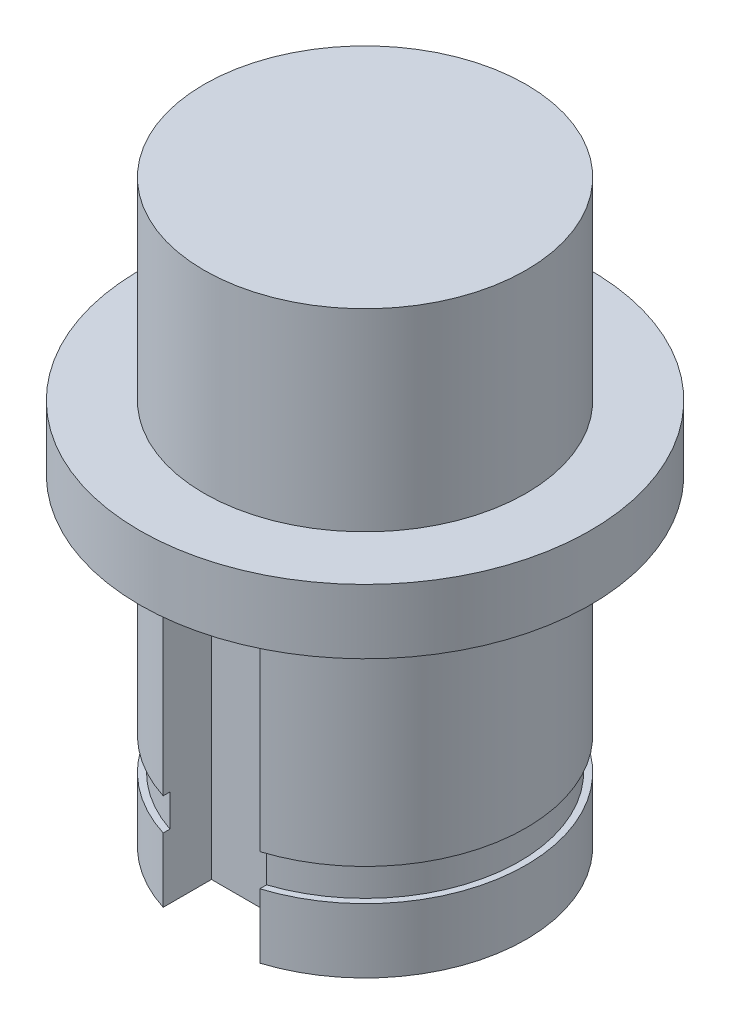
ISO-10303-21;
HEADER;
FILE_DESCRIPTION(('STEP AP214'),'2;1');
FILE_NAME('part.step','',(''),(''),'','','');
FILE_SCHEMA(('AUTOMOTIVE_DESIGN { 1 0 10303 214 1 1 1 1 }'));
ENDSEC;
DATA;
#1=APPLICATION_CONTEXT('core data for automotive mechanical design processes');
#2=APPLICATION_PROTOCOL_DEFINITION('international standard','automotive_design',2000,#1);
#3=PRODUCT_CONTEXT('',#1,'mechanical');
#4=PRODUCT('Part','Part','',(#3));
#5=PRODUCT_RELATED_PRODUCT_CATEGORY('part','',(#4));
#6=PRODUCT_DEFINITION_FORMATION('','',#4);
#7=PRODUCT_DEFINITION_CONTEXT('part definition',#1,'design');
#8=PRODUCT_DEFINITION('design','',#6,#7);
#9=PRODUCT_DEFINITION_SHAPE('','',#8);
#10=(LENGTH_UNIT() NAMED_UNIT(*) SI_UNIT(.MILLI.,.METRE.));
#11=(NAMED_UNIT(*) PLANE_ANGLE_UNIT() SI_UNIT($,.RADIAN.));
#12=(NAMED_UNIT(*) SI_UNIT($,.STERADIAN.) SOLID_ANGLE_UNIT());
#13=UNCERTAINTY_MEASURE_WITH_UNIT(LENGTH_MEASURE(1.E-05),#10,'distance_accuracy_value','');
#14=(GEOMETRIC_REPRESENTATION_CONTEXT(3) GLOBAL_UNCERTAINTY_ASSIGNED_CONTEXT((#13)) GLOBAL_UNIT_ASSIGNED_CONTEXT((#10,
#11,#12)) REPRESENTATION_CONTEXT('',''));
#15=CARTESIAN_POINT('',(0.,0.,0.));
#16=DIRECTION('',(0.,0.,1.));
#17=DIRECTION('',(1.,0.,0.));
#18=AXIS2_PLACEMENT_3D('',#15,#16,#17);
#19=CARTESIAN_POINT('',(0.,18.,0.));
#20=DIRECTION('',(0.,-1.,0.));
#21=DIRECTION('',(0.,0.,-1.));
#22=AXIS2_PLACEMENT_3D('',#19,#20,#21);
#23=CYLINDRICAL_SURFACE('',#22,5.);
#24=DIRECTION('',(0.,1.,0.));
#25=VECTOR('',#24,1.);
#26=CARTESIAN_POINT('',(1.5,-48.4477204006491,4.76969600708473));
#27=LINE('',#26,#25);
#28=CARTESIAN_POINT('',(1.5,0.,4.76969600708473));
#29=VERTEX_POINT('',#28);
#30=CARTESIAN_POINT('',(1.5,1.99999999999998,4.76969600708473));
#31=VERTEX_POINT('',#30);
#32=EDGE_CURVE('E152',#29,#31,#27,.T.);
#33=ORIENTED_EDGE('',*,*,#32,.F.);
#34=CARTESIAN_POINT('',(0.,0.,0.));
#35=DIRECTION('',(0.,1.,0.));
#36=DIRECTION('',(0.,0.,1.));
#37=AXIS2_PLACEMENT_3D('',#34,#35,#36);
#38=CIRCLE('',#37,5.);
#39=CARTESIAN_POINT('',(-1.5,0.,4.76969600708473));
#40=VERTEX_POINT('',#39);
#41=EDGE_CURVE('E185',#29,#40,#38,.T.);
#42=ORIENTED_EDGE('',*,*,#41,.T.);
#43=DIRECTION('',(0.,1.,0.));
#44=VECTOR('',#43,1.);
#45=CARTESIAN_POINT('',(-1.5,-48.4477204006491,4.76969600708473));
#46=LINE('',#45,#44);
#47=CARTESIAN_POINT('',(-1.5,1.99999999999998,4.76969600708473));
#48=VERTEX_POINT('',#47);
#49=EDGE_CURVE('E144',#40,#48,#46,.T.);
#50=ORIENTED_EDGE('',*,*,#49,.T.);
#51=CARTESIAN_POINT('',(0.,2.,0.));
#52=DIRECTION('',(0.,1.,0.));
#53=DIRECTION('',(0.,0.,1.));
#54=AXIS2_PLACEMENT_3D('',#51,#52,#53);
#55=CIRCLE('',#54,5.);
#56=EDGE_CURVE('E164',#31,#48,#55,.T.);
#57=ORIENTED_EDGE('',*,*,#56,.F.);
#58=EDGE_LOOP('',(#33,#42,#50,#57));
#59=FACE_BOUND('',#58,.T.);
#60=ADVANCED_FACE('F33',(#59),#23,.T.);
#61=CARTESIAN_POINT('',(1.5,2.99999999999998,4.76969600708473));
#62=VERTEX_POINT('',#61);
#63=CARTESIAN_POINT('',(1.5,9.99999999999999,4.76969600708473));
#64=VERTEX_POINT('',#63);
#65=EDGE_CURVE('E151',#62,#64,#27,.T.);
#66=ORIENTED_EDGE('',*,*,#65,.F.);
#67=CARTESIAN_POINT('',(0.,3.,0.));
#68=DIRECTION('',(0.,1.,0.));
#69=DIRECTION('',(0.,0.,1.));
#70=AXIS2_PLACEMENT_3D('',#67,#68,#69);
#71=CIRCLE('',#70,5.);
#72=CARTESIAN_POINT('',(-1.5,2.99999999999998,4.76969600708473));
#73=VERTEX_POINT('',#72);
#74=EDGE_CURVE('E173',#62,#73,#71,.T.);
#75=ORIENTED_EDGE('',*,*,#74,.T.);
#76=CARTESIAN_POINT('',(-1.5,9.99999999999999,4.76969600708473));
#77=VERTEX_POINT('',#76);
#78=EDGE_CURVE('E134',#73,#77,#46,.T.);
#79=ORIENTED_EDGE('',*,*,#78,.T.);
#80=CARTESIAN_POINT('',(0.,10.,0.));
#81=DIRECTION('',(0.,1.,0.));
#82=DIRECTION('',(0.,0.,1.));
#83=AXIS2_PLACEMENT_3D('',#80,#81,#82);
#84=CIRCLE('',#83,5.);
#85=EDGE_CURVE('E189',#64,#77,#84,.T.);
#86=ORIENTED_EDGE('',*,*,#85,.F.);
#87=EDGE_LOOP('',(#66,#75,#79,#86));
#88=FACE_BOUND('',#87,.T.);
#89=ADVANCED_FACE('F219',(#88),#23,.T.);
#90=CARTESIAN_POINT('',(0.,0.,0.));
#91=DIRECTION('',(0.,1.,0.));
#92=DIRECTION('',(0.,0.,1.));
#93=AXIS2_PLACEMENT_3D('',#90,#91,#92);
#94=PLANE('',#93);
#95=DIRECTION('',(-1.,0.,0.));
#96=VECTOR('',#95,1.);
#97=CARTESIAN_POINT('',(1.5,0.,2.));
#98=LINE('',#97,#96);
#99=CARTESIAN_POINT('',(1.5,0.,2.));
#100=VERTEX_POINT('',#99);
#101=CARTESIAN_POINT('',(-1.5,0.,2.));
#102=VERTEX_POINT('',#101);
#103=EDGE_CURVE('E122',#100,#102,#98,.T.);
#104=ORIENTED_EDGE('',*,*,#103,.F.);
#105=CARTESIAN_POINT('',(0.,0.,0.));
#106=DIRECTION('',(0.,-1.,0.));
#107=DIRECTION('',(0.,0.,-1.));
#108=AXIS2_PLACEMENT_3D('',#105,#106,#107);
#109=CIRCLE('',#108,2.5);
#110=EDGE_CURVE('E48',#102,#100,#109,.T.);
#111=ORIENTED_EDGE('',*,*,#110,.F.);
#112=EDGE_LOOP('',(#104,#111));
#113=FACE_BOUND('',#112,.T.);
#114=DIRECTION('',(0.,0.,1.));
#115=VECTOR('',#114,1.);
#116=CARTESIAN_POINT('',(1.5,0.,4.76969600708473));
#117=LINE('',#116,#115);
#118=CARTESIAN_POINT('',(1.5,0.,3.26969600708473));
#119=VERTEX_POINT('',#118);
#120=EDGE_CURVE('E129',#119,#29,#117,.T.);
#121=ORIENTED_EDGE('',*,*,#120,.F.);
#122=DIRECTION('',(1.,0.,0.));
#123=VECTOR('',#122,1.);
#124=CARTESIAN_POINT('',(-1.5,0.,3.26969600708473));
#125=LINE('',#124,#123);
#126=CARTESIAN_POINT('',(-1.5,0.,3.26969600708473));
#127=VERTEX_POINT('',#126);
#128=EDGE_CURVE('E141',#127,#119,#125,.T.);
#129=ORIENTED_EDGE('',*,*,#128,.F.);
#130=DIRECTION('',(0.,0.,-1.));
#131=VECTOR('',#130,1.);
#132=CARTESIAN_POINT('',(-1.5,0.,4.76969600708473));
#133=LINE('',#132,#131);
#134=EDGE_CURVE('E138',#40,#127,#133,.T.);
#135=ORIENTED_EDGE('',*,*,#134,.F.);
#136=ORIENTED_EDGE('',*,*,#41,.F.);
#137=EDGE_LOOP('',(#121,#129,#135,#136));
#138=FACE_BOUND('',#137,.T.);
#139=ADVANCED_FACE('F227',(#113,#138),#94,.F.);
#140=CARTESIAN_POINT('',(0.,12.,0.));
#141=DIRECTION('',(0.,1.,0.));
#142=DIRECTION('',(0.,0.,1.));
#143=AXIS2_PLACEMENT_3D('',#140,#141,#142);
#144=CIRCLE('',#143,5.);
#145=CARTESIAN_POINT('',(0.,12.,5.));
#146=VERTEX_POINT('',#145);
#147=EDGE_CURVE('E179',#146,#146,#144,.T.);
#148=ORIENTED_EDGE('',*,*,#147,.T.);
#149=EDGE_LOOP('',(#148));
#150=FACE_BOUND('',#149,.T.);
#151=CARTESIAN_POINT('',(0.,18.,0.));
#152=DIRECTION('',(0.,1.,0.));
#153=DIRECTION('',(0.,0.,1.));
#154=AXIS2_PLACEMENT_3D('',#151,#152,#153);
#155=CIRCLE('',#154,5.);
#156=CARTESIAN_POINT('',(0.,18.,5.));
#157=VERTEX_POINT('',#156);
#158=EDGE_CURVE('E186',#157,#157,#155,.T.);
#159=ORIENTED_EDGE('',*,*,#158,.F.);
#160=EDGE_LOOP('',(#159));
#161=FACE_BOUND('',#160,.T.);
#162=ADVANCED_FACE('F35',(#150,#161),#23,.T.);
#163=CARTESIAN_POINT('',(0.,18.,0.));
#164=DIRECTION('',(0.,1.,0.));
#165=DIRECTION('',(0.,0.,1.));
#166=AXIS2_PLACEMENT_3D('',#163,#164,#165);
#167=PLANE('',#166);
#168=ORIENTED_EDGE('',*,*,#158,.T.);
#169=EDGE_LOOP('',(#168));
#170=FACE_BOUND('',#169,.T.);
#171=ADVANCED_FACE('F244',(#170),#167,.T.);
#172=CARTESIAN_POINT('',(0.,18.,0.));
#173=DIRECTION('',(0.,1.,0.));
#174=DIRECTION('',(0.,0.,1.));
#175=AXIS2_PLACEMENT_3D('',#172,#173,#174);
#176=CYLINDRICAL_SURFACE('',#175,7.);
#177=CARTESIAN_POINT('',(0.,10.,0.));
#178=DIRECTION('',(0.,1.,0.));
#179=DIRECTION('',(0.,0.,1.));
#180=AXIS2_PLACEMENT_3D('',#177,#178,#179);
#181=CIRCLE('',#180,7.);
#182=CARTESIAN_POINT('',(0.,10.,7.));
#183=VERTEX_POINT('',#182);
#184=EDGE_CURVE('E176',#183,#183,#181,.T.);
#185=ORIENTED_EDGE('',*,*,#184,.T.);
#186=EDGE_LOOP('',(#185));
#187=FACE_BOUND('',#186,.T.);
#188=CARTESIAN_POINT('',(0.,12.,0.));
#189=DIRECTION('',(0.,1.,0.));
#190=DIRECTION('',(0.,0.,1.));
#191=AXIS2_PLACEMENT_3D('',#188,#189,#190);
#192=CIRCLE('',#191,7.);
#193=CARTESIAN_POINT('',(0.,12.,7.));
#194=VERTEX_POINT('',#193);
#195=EDGE_CURVE('E182',#194,#194,#192,.T.);
#196=ORIENTED_EDGE('',*,*,#195,.F.);
#197=EDGE_LOOP('',(#196));
#198=FACE_BOUND('',#197,.T.);
#199=ADVANCED_FACE('F249',(#187,#198),#176,.T.);
#200=CARTESIAN_POINT('',(0.,12.,0.));
#201=DIRECTION('',(0.,1.,0.));
#202=DIRECTION('',(0.,0.,1.));
#203=AXIS2_PLACEMENT_3D('',#200,#201,#202);
#204=PLANE('',#203);
#205=ORIENTED_EDGE('',*,*,#195,.T.);
#206=EDGE_LOOP('',(#205));
#207=FACE_BOUND('',#206,.T.);
#208=ORIENTED_EDGE('',*,*,#147,.F.);
#209=EDGE_LOOP('',(#208));
#210=FACE_BOUND('',#209,.T.);
#211=ADVANCED_FACE('F258',(#207,#210),#204,.T.);
#212=CARTESIAN_POINT('',(0.,10.,0.));
#213=DIRECTION('',(0.,1.,0.));
#214=DIRECTION('',(0.,0.,1.));
#215=AXIS2_PLACEMENT_3D('',#212,#213,#214);
#216=PLANE('',#215);
#217=ORIENTED_EDGE('',*,*,#184,.F.);
#218=EDGE_LOOP('',(#217));
#219=FACE_BOUND('',#218,.T.);
#220=ORIENTED_EDGE('',*,*,#85,.T.);
#221=DIRECTION('',(0.,0.,-1.));
#222=VECTOR('',#221,1.);
#223=CARTESIAN_POINT('',(-1.5,10.,4.76969600708473));
#224=LINE('',#223,#222);
#225=CARTESIAN_POINT('',(-1.5,9.99999999999999,3.26969600708473));
#226=VERTEX_POINT('',#225);
#227=EDGE_CURVE('E136',#77,#226,#224,.T.);
#228=ORIENTED_EDGE('',*,*,#227,.T.);
#229=DIRECTION('',(1.,0.,0.));
#230=VECTOR('',#229,1.);
#231=CARTESIAN_POINT('',(-1.5,10.,3.26969600708473));
#232=LINE('',#231,#230);
#233=CARTESIAN_POINT('',(1.5,9.99999999999999,3.26969600708473));
#234=VERTEX_POINT('',#233);
#235=EDGE_CURVE('E135',#226,#234,#232,.T.);
#236=ORIENTED_EDGE('',*,*,#235,.T.);
#237=DIRECTION('',(0.,0.,1.));
#238=VECTOR('',#237,1.);
#239=CARTESIAN_POINT('',(1.5,10.,4.76969600708473));
#240=LINE('',#239,#238);
#241=EDGE_CURVE('E131',#234,#64,#240,.T.);
#242=ORIENTED_EDGE('',*,*,#241,.T.);
#243=EDGE_LOOP('',(#220,#228,#236,#242));
#244=FACE_BOUND('',#243,.T.);
#245=ADVANCED_FACE('F222',(#219,#244),#216,.F.);
#246=CARTESIAN_POINT('',(0.,3.,0.));
#247=DIRECTION('',(0.,1.,0.));
#248=DIRECTION('',(0.,0.,1.));
#249=AXIS2_PLACEMENT_3D('',#246,#247,#248);
#250=PLANE('',#249);
#251=ORIENTED_EDGE('',*,*,#74,.F.);
#252=DIRECTION('',(0.,0.,-1.));
#253=VECTOR('',#252,1.);
#254=CARTESIAN_POINT('',(1.5,3.,0.));
#255=LINE('',#254,#253);
#256=CARTESIAN_POINT('',(1.5,3.,4.5596052460712));
#257=VERTEX_POINT('',#256);
#258=EDGE_CURVE('E161',#62,#257,#255,.T.);
#259=ORIENTED_EDGE('',*,*,#258,.T.);
#260=CARTESIAN_POINT('',(0.,3.,0.));
#261=DIRECTION('',(0.,1.,0.));
#262=DIRECTION('',(0.,0.,1.));
#263=AXIS2_PLACEMENT_3D('',#260,#261,#262);
#264=CIRCLE('',#263,4.8);
#265=CARTESIAN_POINT('',(-1.5,3.,4.5596052460712));
#266=VERTEX_POINT('',#265);
#267=EDGE_CURVE('E170',#257,#266,#264,.T.);
#268=ORIENTED_EDGE('',*,*,#267,.T.);
#269=DIRECTION('',(0.,0.,1.));
#270=VECTOR('',#269,1.);
#271=CARTESIAN_POINT('',(-1.5,3.,0.));
#272=LINE('',#271,#270);
#273=EDGE_CURVE('E156',#266,#73,#272,.T.);
#274=ORIENTED_EDGE('',*,*,#273,.T.);
#275=EDGE_LOOP('',(#251,#259,#268,#274));
#276=FACE_BOUND('',#275,.T.);
#277=ADVANCED_FACE('F214',(#276),#250,.F.);
#278=CARTESIAN_POINT('',(0.,18.,0.));
#279=DIRECTION('',(0.,1.,0.));
#280=DIRECTION('',(0.,0.,1.));
#281=AXIS2_PLACEMENT_3D('',#278,#279,#280);
#282=CYLINDRICAL_SURFACE('',#281,4.8);
#283=DIRECTION('',(0.,1.,0.));
#284=VECTOR('',#283,1.);
#285=CARTESIAN_POINT('',(1.5,18.,4.5596052460712));
#286=LINE('',#285,#284);
#287=CARTESIAN_POINT('',(1.5,2.,4.5596052460712));
#288=VERTEX_POINT('',#287);
#289=EDGE_CURVE('E159',#288,#257,#286,.T.);
#290=ORIENTED_EDGE('',*,*,#289,.F.);
#291=CARTESIAN_POINT('',(0.,2.,0.));
#292=DIRECTION('',(0.,1.,0.));
#293=DIRECTION('',(0.,0.,1.));
#294=AXIS2_PLACEMENT_3D('',#291,#292,#293);
#295=CIRCLE('',#294,4.8);
#296=CARTESIAN_POINT('',(-1.5,2.,4.5596052460712));
#297=VERTEX_POINT('',#296);
#298=EDGE_CURVE('E167',#288,#297,#295,.T.);
#299=ORIENTED_EDGE('',*,*,#298,.T.);
#300=DIRECTION('',(0.,1.,0.));
#301=VECTOR('',#300,1.);
#302=CARTESIAN_POINT('',(-1.5,18.,4.5596052460712));
#303=LINE('',#302,#301);
#304=EDGE_CURVE('E154',#266,#297,#303,.F.);
#305=ORIENTED_EDGE('',*,*,#304,.F.);
#306=ORIENTED_EDGE('',*,*,#267,.F.);
#307=EDGE_LOOP('',(#290,#299,#305,#306));
#308=FACE_BOUND('',#307,.T.);
#309=ADVANCED_FACE('F211',(#308),#282,.T.);
#310=CARTESIAN_POINT('',(0.,2.,0.));
#311=DIRECTION('',(0.,1.,0.));
#312=DIRECTION('',(0.,0.,1.));
#313=AXIS2_PLACEMENT_3D('',#310,#311,#312);
#314=PLANE('',#313);
#315=DIRECTION('',(0.,0.,-1.));
#316=VECTOR('',#315,1.);
#317=CARTESIAN_POINT('',(1.5,2.,0.));
#318=LINE('',#317,#316);
#319=EDGE_CURVE('E11',#31,#288,#318,.T.);
#320=ORIENTED_EDGE('',*,*,#319,.F.);
#321=ORIENTED_EDGE('',*,*,#56,.T.);
#322=DIRECTION('',(0.,0.,1.));
#323=VECTOR('',#322,1.);
#324=CARTESIAN_POINT('',(-1.5,2.,0.));
#325=LINE('',#324,#323);
#326=EDGE_CURVE('E41',#297,#48,#325,.T.);
#327=ORIENTED_EDGE('',*,*,#326,.F.);
#328=ORIENTED_EDGE('',*,*,#298,.F.);
#329=EDGE_LOOP('',(#320,#321,#327,#328));
#330=FACE_BOUND('',#329,.T.);
#331=ADVANCED_FACE('F205',(#330),#314,.T.);
#332=CARTESIAN_POINT('',(1.5,-48.4477204006491,4.76969600708473));
#333=DIRECTION('',(1.,0.,0.));
#334=DIRECTION('',(0.,0.,-1.));
#335=AXIS2_PLACEMENT_3D('',#332,#333,#334);
#336=PLANE('',#335);
#337=ORIENTED_EDGE('',*,*,#258,.F.);
#338=ORIENTED_EDGE('',*,*,#65,.T.);
#339=ORIENTED_EDGE('',*,*,#241,.F.);
#340=DIRECTION('',(0.,1.,0.));
#341=VECTOR('',#340,1.);
#342=CARTESIAN_POINT('',(1.5,-48.4477204006491,3.26969600708473));
#343=LINE('',#342,#341);
#344=EDGE_CURVE('E148',#119,#234,#343,.T.);
#345=ORIENTED_EDGE('',*,*,#344,.F.);
#346=ORIENTED_EDGE('',*,*,#120,.T.);
#347=ORIENTED_EDGE('',*,*,#32,.T.);
#348=ORIENTED_EDGE('',*,*,#319,.T.);
#349=ORIENTED_EDGE('',*,*,#289,.T.);
#350=EDGE_LOOP('',(#337,#338,#339,#345,#346,#347,#348,#349));
#351=FACE_BOUND('',#350,.T.);
#352=ADVANCED_FACE('F208',(#351),#336,.F.);
#353=CARTESIAN_POINT('',(-1.5,-48.4477204006491,4.76969600708473));
#354=DIRECTION('',(-1.,0.,0.));
#355=DIRECTION('',(0.,0.,1.));
#356=AXIS2_PLACEMENT_3D('',#353,#354,#355);
#357=PLANE('',#356);
#358=ORIENTED_EDGE('',*,*,#273,.F.);
#359=ORIENTED_EDGE('',*,*,#304,.T.);
#360=ORIENTED_EDGE('',*,*,#326,.T.);
#361=ORIENTED_EDGE('',*,*,#49,.F.);
#362=ORIENTED_EDGE('',*,*,#134,.T.);
#363=DIRECTION('',(0.,1.,0.));
#364=VECTOR('',#363,1.);
#365=CARTESIAN_POINT('',(-1.5,-48.4477204006491,3.26969600708473));
#366=LINE('',#365,#364);
#367=EDGE_CURVE('E56',#127,#226,#366,.T.);
#368=ORIENTED_EDGE('',*,*,#367,.T.);
#369=ORIENTED_EDGE('',*,*,#227,.F.);
#370=ORIENTED_EDGE('',*,*,#78,.F.);
#371=EDGE_LOOP('',(#358,#359,#360,#361,#362,#368,#369,#370));
#372=FACE_BOUND('',#371,.T.);
#373=ADVANCED_FACE('F195',(#372),#357,.F.);
#374=CARTESIAN_POINT('',(-1.5,-48.4477204006491,3.26969600708473));
#375=DIRECTION('',(0.,0.,-1.));
#376=DIRECTION('',(-1.,0.,0.));
#377=AXIS2_PLACEMENT_3D('',#374,#375,#376);
#378=PLANE('',#377);
#379=ORIENTED_EDGE('',*,*,#128,.T.);
#380=ORIENTED_EDGE('',*,*,#344,.T.);
#381=ORIENTED_EDGE('',*,*,#235,.F.);
#382=ORIENTED_EDGE('',*,*,#367,.F.);
#383=EDGE_LOOP('',(#379,#380,#381,#382));
#384=FACE_BOUND('',#383,.T.);
#385=ADVANCED_FACE('F228',(#384),#378,.F.);
#386=CARTESIAN_POINT('',(0.,16.,0.));
#387=DIRECTION('',(0.,-1.,0.));
#388=DIRECTION('',(0.,0.,-1.));
#389=AXIS2_PLACEMENT_3D('',#386,#387,#388);
#390=CYLINDRICAL_SURFACE('',#389,2.5);
#391=ORIENTED_EDGE('',*,*,#110,.T.);
#392=DIRECTION('',(0.,-1.,0.));
#393=VECTOR('',#392,1.);
#394=CARTESIAN_POINT('',(1.5,16.,2.));
#395=LINE('',#394,#393);
#396=CARTESIAN_POINT('',(1.5,16.,2.));
#397=VERTEX_POINT('',#396);
#398=EDGE_CURVE('E108',#397,#100,#395,.T.);
#399=ORIENTED_EDGE('',*,*,#398,.F.);
#400=CARTESIAN_POINT('',(0.,16.,0.));
#401=DIRECTION('',(0.,-1.,0.));
#402=DIRECTION('',(0.,0.,-1.));
#403=AXIS2_PLACEMENT_3D('',#400,#401,#402);
#404=CIRCLE('',#403,2.5);
#405=CARTESIAN_POINT('',(-1.5,16.,2.));
#406=VERTEX_POINT('',#405);
#407=EDGE_CURVE('E111',#406,#397,#404,.T.);
#408=ORIENTED_EDGE('',*,*,#407,.F.);
#409=DIRECTION('',(0.,-1.,0.));
#410=VECTOR('',#409,1.);
#411=CARTESIAN_POINT('',(-1.5,16.,2.));
#412=LINE('',#411,#410);
#413=EDGE_CURVE('E117',#406,#102,#412,.T.);
#414=ORIENTED_EDGE('',*,*,#413,.T.);
#415=EDGE_LOOP('',(#391,#399,#408,#414));
#416=FACE_BOUND('',#415,.T.);
#417=ADVANCED_FACE('F110',(#416),#390,.F.);
#418=CARTESIAN_POINT('',(1.5,16.,2.));
#419=DIRECTION('',(0.,0.,1.));
#420=DIRECTION('',(1.,0.,0.));
#421=AXIS2_PLACEMENT_3D('',#418,#419,#420);
#422=PLANE('',#421);
#423=ORIENTED_EDGE('',*,*,#103,.T.);
#424=ORIENTED_EDGE('',*,*,#413,.F.);
#425=DIRECTION('',(-1.,0.,0.));
#426=VECTOR('',#425,1.);
#427=CARTESIAN_POINT('',(1.5,16.,2.));
#428=LINE('',#427,#426);
#429=EDGE_CURVE('E118',#397,#406,#428,.T.);
#430=ORIENTED_EDGE('',*,*,#429,.F.);
#431=ORIENTED_EDGE('',*,*,#398,.T.);
#432=EDGE_LOOP('',(#423,#424,#430,#431));
#433=FACE_BOUND('',#432,.T.);
#434=ADVANCED_FACE('F124',(#433),#422,.F.);
#435=CARTESIAN_POINT('',(0.,16.,0.));
#436=DIRECTION('',(0.,-1.,0.));
#437=DIRECTION('',(0.,0.,-1.));
#438=AXIS2_PLACEMENT_3D('',#435,#436,#437);
#439=PLANE('',#438);
#440=ORIENTED_EDGE('',*,*,#407,.T.);
#441=ORIENTED_EDGE('',*,*,#429,.T.);
#442=EDGE_LOOP('',(#440,#441));
#443=FACE_BOUND('',#442,.T.);
#444=ADVANCED_FACE('F121',(#443),#439,.T.);
#445=CLOSED_SHELL('',(#60,#89,#139,#162,#171,#199,#211,#245,#277,#309,#331,#352,#373,#385,#417,
#434,#444));
#446=MANIFOLD_SOLID_BREP('B2',#445);
#447=ADVANCED_BREP_SHAPE_REPRESENTATION('',(#18,#446),#14);
#448=SHAPE_DEFINITION_REPRESENTATION(#9,#447);
ENDSEC;
END-ISO-10303-21;
